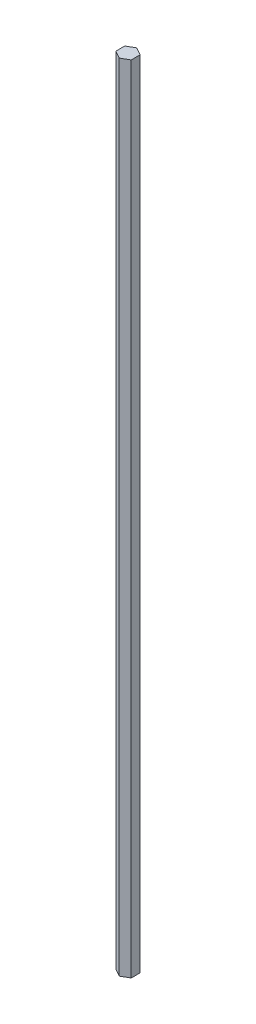
ISO-10303-21;
HEADER;
FILE_DESCRIPTION(('STEP AP214'),'2;1');
FILE_NAME('part.step','',(''),(''),'','','');
FILE_SCHEMA(('AUTOMOTIVE_DESIGN { 1 0 10303 214 1 1 1 1 }'));
ENDSEC;
DATA;
#1=APPLICATION_CONTEXT('core data for automotive mechanical design processes');
#2=APPLICATION_PROTOCOL_DEFINITION('international standard','automotive_design',2000,#1);
#3=PRODUCT_CONTEXT('',#1,'mechanical');
#4=PRODUCT('Part','Part','',(#3));
#5=PRODUCT_RELATED_PRODUCT_CATEGORY('part','',(#4));
#6=PRODUCT_DEFINITION_FORMATION('','',#4);
#7=PRODUCT_DEFINITION_CONTEXT('part definition',#1,'design');
#8=PRODUCT_DEFINITION('design','',#6,#7);
#9=PRODUCT_DEFINITION_SHAPE('','',#8);
#10=(LENGTH_UNIT() NAMED_UNIT(*) SI_UNIT(.MILLI.,.METRE.));
#11=(NAMED_UNIT(*) PLANE_ANGLE_UNIT() SI_UNIT($,.RADIAN.));
#12=(NAMED_UNIT(*) SI_UNIT($,.STERADIAN.) SOLID_ANGLE_UNIT());
#13=UNCERTAINTY_MEASURE_WITH_UNIT(LENGTH_MEASURE(1.E-05),#10,'distance_accuracy_value','');
#14=(GEOMETRIC_REPRESENTATION_CONTEXT(3) GLOBAL_UNCERTAINTY_ASSIGNED_CONTEXT((#13)) GLOBAL_UNIT_ASSIGNED_CONTEXT((#10,
#11,#12)) REPRESENTATION_CONTEXT('',''));
#15=CARTESIAN_POINT('',(0.,0.,0.));
#16=DIRECTION('',(0.,0.,1.));
#17=DIRECTION('',(1.,0.,0.));
#18=AXIS2_PLACEMENT_3D('',#15,#16,#17);
#19=CARTESIAN_POINT('',(6.34999999999996,660.4,-3.6661742093542));
#20=DIRECTION('',(-0.499999999999995,0.,0.866025403784442));
#21=DIRECTION('',(0.866025403784442,0.,0.499999999999995));
#22=AXIS2_PLACEMENT_3D('',#19,#20,#21);
#23=PLANE('',#22);
#24=DIRECTION('',(-0.866025403784441,0.,-0.499999999999995));
#25=VECTOR('',#24,1.);
#26=CARTESIAN_POINT('',(6.34999999999996,0.,-3.6661742093542));
#27=LINE('',#26,#25);
#28=CARTESIAN_POINT('',(6.34999999999996,0.,-3.6661742093542));
#29=VERTEX_POINT('',#28);
#30=CARTESIAN_POINT('',(0.,0.,-7.33234841870825));
#31=VERTEX_POINT('',#30);
#32=EDGE_CURVE('E119',#29,#31,#27,.T.);
#33=ORIENTED_EDGE('',*,*,#32,.T.);
#34=DIRECTION('',(0.,-1.,0.));
#35=VECTOR('',#34,1.);
#36=CARTESIAN_POINT('',(0.,660.4,-7.33234841870825));
#37=LINE('',#36,#35);
#38=CARTESIAN_POINT('',(0.,660.4,-7.33234841870825));
#39=VERTEX_POINT('',#38);
#40=EDGE_CURVE('E11',#39,#31,#37,.T.);
#41=ORIENTED_EDGE('',*,*,#40,.F.);
#42=DIRECTION('',(-0.866025403784441,0.,-0.499999999999995));
#43=VECTOR('',#42,1.);
#44=CARTESIAN_POINT('',(6.34999999999996,660.4,-3.6661742093542));
#45=LINE('',#44,#43);
#46=CARTESIAN_POINT('',(6.34999999999996,660.4,-3.6661742093542));
#47=VERTEX_POINT('',#46);
#48=EDGE_CURVE('E129',#47,#39,#45,.T.);
#49=ORIENTED_EDGE('',*,*,#48,.F.);
#50=DIRECTION('',(0.,-1.,0.));
#51=VECTOR('',#50,1.);
#52=CARTESIAN_POINT('',(6.34999999999996,660.4,-3.6661742093542));
#53=LINE('',#52,#51);
#54=EDGE_CURVE('E115',#47,#29,#53,.T.);
#55=ORIENTED_EDGE('',*,*,#54,.T.);
#56=EDGE_LOOP('',(#33,#41,#49,#55));
#57=FACE_BOUND('',#56,.T.);
#58=ADVANCED_FACE('F35',(#57),#23,.F.);
#59=CARTESIAN_POINT('',(0.,660.4,-7.33234841870825));
#60=DIRECTION('',(0.500000000000001,0.,0.866025403784438));
#61=DIRECTION('',(0.866025403784438,0.,-0.500000000000001));
#62=AXIS2_PLACEMENT_3D('',#59,#60,#61);
#63=PLANE('',#62);
#64=DIRECTION('',(-0.866025403784438,0.,0.500000000000001));
#65=VECTOR('',#64,1.);
#66=CARTESIAN_POINT('',(0.,0.,-7.33234841870825));
#67=LINE('',#66,#65);
#68=CARTESIAN_POINT('',(-6.35000000000001,0.,-3.66617420935411));
#69=VERTEX_POINT('',#68);
#70=EDGE_CURVE('E122',#31,#69,#67,.T.);
#71=ORIENTED_EDGE('',*,*,#70,.T.);
#72=DIRECTION('',(0.,-1.,0.));
#73=VECTOR('',#72,1.);
#74=CARTESIAN_POINT('',(-6.35000000000001,660.4,-3.66617420935411));
#75=LINE('',#74,#73);
#76=CARTESIAN_POINT('',(-6.35000000000001,660.4,-3.66617420935411));
#77=VERTEX_POINT('',#76);
#78=EDGE_CURVE('E43',#77,#69,#75,.T.);
#79=ORIENTED_EDGE('',*,*,#78,.F.);
#80=DIRECTION('',(-0.866025403784438,0.,0.500000000000001));
#81=VECTOR('',#80,1.);
#82=CARTESIAN_POINT('',(0.,660.4,-7.33234841870825));
#83=LINE('',#82,#81);
#84=EDGE_CURVE('E88',#39,#77,#83,.T.);
#85=ORIENTED_EDGE('',*,*,#84,.F.);
#86=ORIENTED_EDGE('',*,*,#40,.T.);
#87=EDGE_LOOP('',(#71,#79,#85,#86));
#88=FACE_BOUND('',#87,.T.);
#89=ADVANCED_FACE('F153',(#88),#63,.F.);
#90=CARTESIAN_POINT('',(-6.35000000000001,660.4,-3.66617420935411));
#91=DIRECTION('',(1.,0.,0.));
#92=DIRECTION('',(0.,0.,-1.));
#93=AXIS2_PLACEMENT_3D('',#90,#91,#92);
#94=PLANE('',#93);
#95=DIRECTION('',(0.,0.,1.));
#96=VECTOR('',#95,1.);
#97=CARTESIAN_POINT('',(-6.35000000000001,0.,-3.66617420935411));
#98=LINE('',#97,#96);
#99=CARTESIAN_POINT('',(-6.34999999999999,0.,3.66617420935416));
#100=VERTEX_POINT('',#99);
#101=EDGE_CURVE('E124',#69,#100,#98,.T.);
#102=ORIENTED_EDGE('',*,*,#101,.T.);
#103=DIRECTION('',(0.,-1.,0.));
#104=VECTOR('',#103,1.);
#105=CARTESIAN_POINT('',(-6.34999999999999,660.4,3.66617420935416));
#106=LINE('',#105,#104);
#107=CARTESIAN_POINT('',(-6.34999999999999,660.4,3.66617420935416));
#108=VERTEX_POINT('',#107);
#109=EDGE_CURVE('E110',#108,#100,#106,.T.);
#110=ORIENTED_EDGE('',*,*,#109,.F.);
#111=DIRECTION('',(0.,0.,1.));
#112=VECTOR('',#111,1.);
#113=CARTESIAN_POINT('',(-6.35000000000001,660.4,-3.66617420935411));
#114=LINE('',#113,#112);
#115=EDGE_CURVE('E101',#77,#108,#114,.T.);
#116=ORIENTED_EDGE('',*,*,#115,.F.);
#117=ORIENTED_EDGE('',*,*,#78,.T.);
#118=EDGE_LOOP('',(#102,#110,#116,#117));
#119=FACE_BOUND('',#118,.T.);
#120=ADVANCED_FACE('F135',(#119),#94,.F.);
#121=CARTESIAN_POINT('',(-6.34999999999999,660.4,3.66617420935416));
#122=DIRECTION('',(0.499999999999995,0.,-0.866025403784442));
#123=DIRECTION('',(-0.866025403784442,0.,-0.499999999999995));
#124=AXIS2_PLACEMENT_3D('',#121,#122,#123);
#125=PLANE('',#124);
#126=DIRECTION('',(0.866025403784441,0.,0.499999999999995));
#127=VECTOR('',#126,1.);
#128=CARTESIAN_POINT('',(-6.34999999999999,0.,3.66617420935416));
#129=LINE('',#128,#127);
#130=CARTESIAN_POINT('',(0.,0.,7.33234841870825));
#131=VERTEX_POINT('',#130);
#132=EDGE_CURVE('E109',#100,#131,#129,.T.);
#133=ORIENTED_EDGE('',*,*,#132,.T.);
#134=DIRECTION('',(0.,-1.,0.));
#135=VECTOR('',#134,1.);
#136=CARTESIAN_POINT('',(0.,660.4,7.33234841870825));
#137=LINE('',#136,#135);
#138=CARTESIAN_POINT('',(0.,660.4,7.33234841870825));
#139=VERTEX_POINT('',#138);
#140=EDGE_CURVE('E106',#139,#131,#137,.T.);
#141=ORIENTED_EDGE('',*,*,#140,.F.);
#142=DIRECTION('',(0.866025403784441,0.,0.499999999999995));
#143=VECTOR('',#142,1.);
#144=CARTESIAN_POINT('',(-6.34999999999999,660.4,3.66617420935416));
#145=LINE('',#144,#143);
#146=EDGE_CURVE('E95',#108,#139,#145,.T.);
#147=ORIENTED_EDGE('',*,*,#146,.F.);
#148=ORIENTED_EDGE('',*,*,#109,.T.);
#149=EDGE_LOOP('',(#133,#141,#147,#148));
#150=FACE_BOUND('',#149,.T.);
#151=ADVANCED_FACE('F107',(#150),#125,.F.);
#152=CARTESIAN_POINT('',(0.,660.4,7.33234841870825));
#153=DIRECTION('',(-0.500000000000007,0.,-0.866025403784434));
#154=DIRECTION('',(-0.866025403784435,0.,0.500000000000007));
#155=AXIS2_PLACEMENT_3D('',#152,#153,#154);
#156=PLANE('',#155);
#157=DIRECTION('',(0.866025403784435,0.,-0.500000000000007));
#158=VECTOR('',#157,1.);
#159=CARTESIAN_POINT('',(0.,0.,7.33234841870825));
#160=LINE('',#159,#158);
#161=CARTESIAN_POINT('',(6.35000000000004,0.,3.66617420935407));
#162=VERTEX_POINT('',#161);
#163=EDGE_CURVE('E74',#131,#162,#160,.T.);
#164=ORIENTED_EDGE('',*,*,#163,.T.);
#165=DIRECTION('',(0.,-1.,0.));
#166=VECTOR('',#165,1.);
#167=CARTESIAN_POINT('',(6.35000000000004,660.4,3.66617420935407));
#168=LINE('',#167,#166);
#169=CARTESIAN_POINT('',(6.35000000000004,660.4,3.66617420935407));
#170=VERTEX_POINT('',#169);
#171=EDGE_CURVE('E111',#170,#162,#168,.T.);
#172=ORIENTED_EDGE('',*,*,#171,.F.);
#173=DIRECTION('',(0.866025403784435,0.,-0.500000000000007));
#174=VECTOR('',#173,1.);
#175=CARTESIAN_POINT('',(0.,660.4,7.33234841870825));
#176=LINE('',#175,#174);
#177=EDGE_CURVE('E99',#139,#170,#176,.T.);
#178=ORIENTED_EDGE('',*,*,#177,.F.);
#179=ORIENTED_EDGE('',*,*,#140,.T.);
#180=EDGE_LOOP('',(#164,#172,#178,#179));
#181=FACE_BOUND('',#180,.T.);
#182=ADVANCED_FACE('F113',(#181),#156,.F.);
#183=CARTESIAN_POINT('',(6.35000000000004,660.4,3.66617420935407));
#184=DIRECTION('',(-1.,0.,0.));
#185=DIRECTION('',(0.,0.,1.));
#186=AXIS2_PLACEMENT_3D('',#183,#184,#185);
#187=PLANE('',#186);
#188=DIRECTION('',(0.,0.,-1.));
#189=VECTOR('',#188,1.);
#190=CARTESIAN_POINT('',(6.35000000000004,0.,3.66617420935407));
#191=LINE('',#190,#189);
#192=EDGE_CURVE('E80',#162,#29,#191,.T.);
#193=ORIENTED_EDGE('',*,*,#192,.T.);
#194=ORIENTED_EDGE('',*,*,#54,.F.);
#195=DIRECTION('',(0.,0.,-1.));
#196=VECTOR('',#195,1.);
#197=CARTESIAN_POINT('',(6.35000000000004,660.4,3.66617420935407));
#198=LINE('',#197,#196);
#199=EDGE_CURVE('E51',#170,#47,#198,.T.);
#200=ORIENTED_EDGE('',*,*,#199,.F.);
#201=ORIENTED_EDGE('',*,*,#171,.T.);
#202=EDGE_LOOP('',(#193,#194,#200,#201));
#203=FACE_BOUND('',#202,.T.);
#204=ADVANCED_FACE('F142',(#203),#187,.F.);
#205=CARTESIAN_POINT('',(0.,660.4,0.));
#206=DIRECTION('',(0.,1.,0.));
#207=DIRECTION('',(0.,0.,1.));
#208=AXIS2_PLACEMENT_3D('',#205,#206,#207);
#209=PLANE('',#208);
#210=ORIENTED_EDGE('',*,*,#48,.T.);
#211=ORIENTED_EDGE('',*,*,#84,.T.);
#212=ORIENTED_EDGE('',*,*,#115,.T.);
#213=ORIENTED_EDGE('',*,*,#146,.T.);
#214=ORIENTED_EDGE('',*,*,#177,.T.);
#215=ORIENTED_EDGE('',*,*,#199,.T.);
#216=EDGE_LOOP('',(#210,#211,#212,#213,#214,#215));
#217=FACE_BOUND('',#216,.T.);
#218=ADVANCED_FACE('F97',(#217),#209,.T.);
#219=CARTESIAN_POINT('',(0.,0.,0.));
#220=DIRECTION('',(0.,1.,0.));
#221=DIRECTION('',(0.,0.,1.));
#222=AXIS2_PLACEMENT_3D('',#219,#220,#221);
#223=PLANE('',#222);
#224=ORIENTED_EDGE('',*,*,#32,.F.);
#225=ORIENTED_EDGE('',*,*,#192,.F.);
#226=ORIENTED_EDGE('',*,*,#163,.F.);
#227=ORIENTED_EDGE('',*,*,#132,.F.);
#228=ORIENTED_EDGE('',*,*,#101,.F.);
#229=ORIENTED_EDGE('',*,*,#70,.F.);
#230=EDGE_LOOP('',(#224,#225,#226,#227,#228,#229));
#231=FACE_BOUND('',#230,.T.);
#232=ADVANCED_FACE('F138',(#231),#223,.F.);
#233=CLOSED_SHELL('',(#58,#89,#120,#151,#182,#204,#218,#232));
#234=MANIFOLD_SOLID_BREP('B2',#233);
#235=ADVANCED_BREP_SHAPE_REPRESENTATION('',(#18,#234),#14);
#236=SHAPE_DEFINITION_REPRESENTATION(#9,#235);
ENDSEC;
END-ISO-10303-21;
